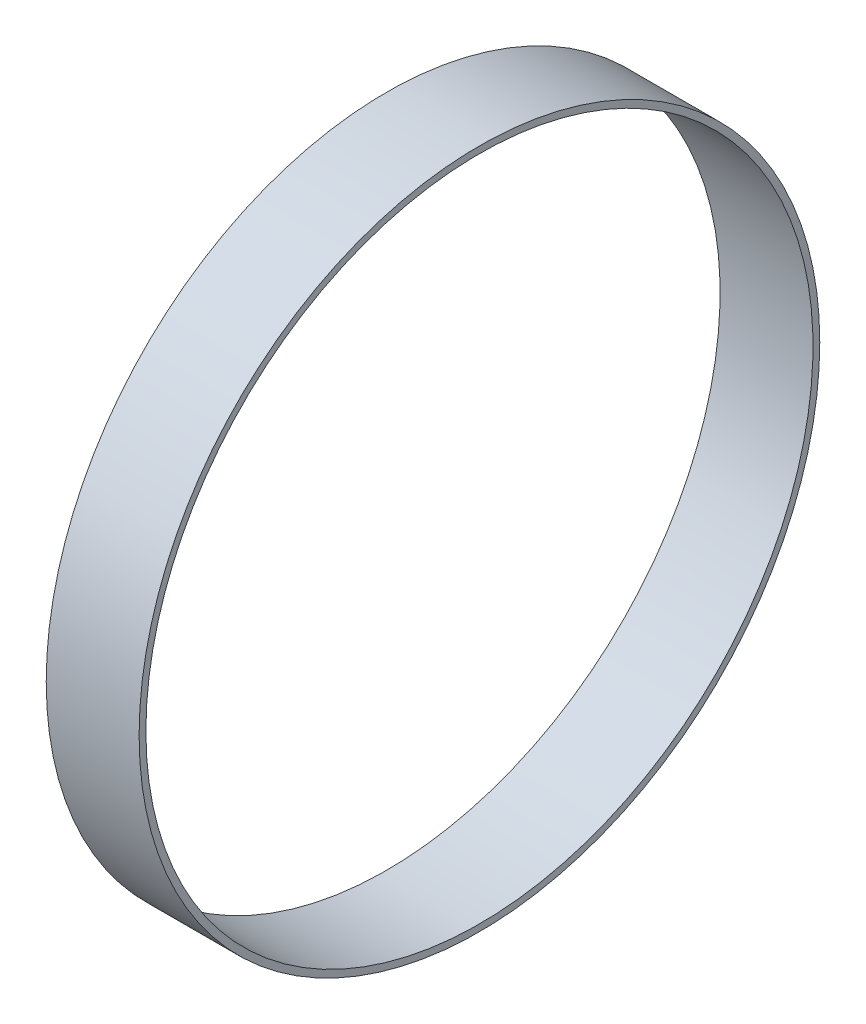
ISO-10303-21;
HEADER;
FILE_DESCRIPTION(('STEP AP214'),'2;1');
FILE_NAME('part.step','',(''),(''),'','','');
FILE_SCHEMA(('AUTOMOTIVE_DESIGN { 1 0 10303 214 1 1 1 1 }'));
ENDSEC;
DATA;
#1=APPLICATION_CONTEXT('core data for automotive mechanical design processes');
#2=APPLICATION_PROTOCOL_DEFINITION('international standard','automotive_design',2000,#1);
#3=PRODUCT_CONTEXT('',#1,'mechanical');
#4=PRODUCT('Part','Part','',(#3));
#5=PRODUCT_RELATED_PRODUCT_CATEGORY('part','',(#4));
#6=PRODUCT_DEFINITION_FORMATION('','',#4);
#7=PRODUCT_DEFINITION_CONTEXT('part definition',#1,'design');
#8=PRODUCT_DEFINITION('design','',#6,#7);
#9=PRODUCT_DEFINITION_SHAPE('','',#8);
#10=(LENGTH_UNIT() NAMED_UNIT(*) SI_UNIT(.MILLI.,.METRE.));
#11=(NAMED_UNIT(*) PLANE_ANGLE_UNIT() SI_UNIT($,.RADIAN.));
#12=(NAMED_UNIT(*) SI_UNIT($,.STERADIAN.) SOLID_ANGLE_UNIT());
#13=UNCERTAINTY_MEASURE_WITH_UNIT(LENGTH_MEASURE(1.E-05),#10,'distance_accuracy_value','');
#14=(GEOMETRIC_REPRESENTATION_CONTEXT(3) GLOBAL_UNCERTAINTY_ASSIGNED_CONTEXT((#13)) GLOBAL_UNIT_ASSIGNED_CONTEXT((#10,
#11,#12)) REPRESENTATION_CONTEXT('',''));
#15=CARTESIAN_POINT('',(0.,0.,0.));
#16=DIRECTION('',(0.,0.,1.));
#17=DIRECTION('',(1.,0.,0.));
#18=AXIS2_PLACEMENT_3D('',#15,#16,#17);
#19=CARTESIAN_POINT('',(0.,0.,0.));
#20=DIRECTION('',(-1.,0.,0.));
#21=DIRECTION('',(0.,0.,1.));
#22=AXIS2_PLACEMENT_3D('',#19,#20,#21);
#23=CYLINDRICAL_SURFACE('',#22,49.2);
#24=CARTESIAN_POINT('',(91.8,0.,0.));
#25=DIRECTION('',(-1.,0.,0.));
#26=DIRECTION('',(0.,0.,1.));
#27=AXIS2_PLACEMENT_3D('',#24,#25,#26);
#28=CIRCLE('',#27,49.2);
#29=CARTESIAN_POINT('',(91.8,0.,49.2));
#30=VERTEX_POINT('',#29);
#31=EDGE_CURVE('E43',#30,#30,#28,.T.);
#32=ORIENTED_EDGE('',*,*,#31,.F.);
#33=EDGE_LOOP('',(#32));
#34=FACE_BOUND('',#33,.T.);
#35=CARTESIAN_POINT('',(78.1,0.,0.));
#36=DIRECTION('',(-1.,0.,0.));
#37=DIRECTION('',(0.,0.,1.));
#38=AXIS2_PLACEMENT_3D('',#35,#36,#37);
#39=CIRCLE('',#38,49.2);
#40=CARTESIAN_POINT('',(78.1,0.,49.2));
#41=VERTEX_POINT('',#40);
#42=EDGE_CURVE('E10',#41,#41,#39,.T.);
#43=ORIENTED_EDGE('',*,*,#42,.T.);
#44=EDGE_LOOP('',(#43));
#45=FACE_BOUND('',#44,.T.);
#46=ADVANCED_FACE('F29',(#34,#45),#23,.F.);
#47=CARTESIAN_POINT('',(78.1,49.2,0.));
#48=DIRECTION('',(-1.,0.,0.));
#49=DIRECTION('',(0.,0.,1.));
#50=AXIS2_PLACEMENT_3D('',#47,#48,#49);
#51=PLANE('',#50);
#52=CARTESIAN_POINT('',(78.1,0.,0.));
#53=DIRECTION('',(-1.,0.,0.));
#54=DIRECTION('',(0.,0.,1.));
#55=AXIS2_PLACEMENT_3D('',#52,#53,#54);
#56=CIRCLE('',#55,50.2);
#57=CARTESIAN_POINT('',(78.1,0.,50.2));
#58=VERTEX_POINT('',#57);
#59=EDGE_CURVE('E35',#58,#58,#56,.T.);
#60=ORIENTED_EDGE('',*,*,#59,.T.);
#61=EDGE_LOOP('',(#60));
#62=FACE_BOUND('',#61,.T.);
#63=ORIENTED_EDGE('',*,*,#42,.F.);
#64=EDGE_LOOP('',(#63));
#65=FACE_BOUND('',#64,.T.);
#66=ADVANCED_FACE('F53',(#62,#65),#51,.T.);
#67=CARTESIAN_POINT('',(0.,0.,0.));
#68=DIRECTION('',(-1.,0.,0.));
#69=DIRECTION('',(0.,0.,1.));
#70=AXIS2_PLACEMENT_3D('',#67,#68,#69);
#71=CYLINDRICAL_SURFACE('',#70,50.2);
#72=CARTESIAN_POINT('',(91.8,0.,0.));
#73=DIRECTION('',(-1.,0.,0.));
#74=DIRECTION('',(0.,0.,1.));
#75=AXIS2_PLACEMENT_3D('',#72,#73,#74);
#76=CIRCLE('',#75,50.2);
#77=CARTESIAN_POINT('',(91.8,0.,50.2));
#78=VERTEX_POINT('',#77);
#79=EDGE_CURVE('E39',#78,#78,#76,.T.);
#80=ORIENTED_EDGE('',*,*,#79,.T.);
#81=EDGE_LOOP('',(#80));
#82=FACE_BOUND('',#81,.T.);
#83=ORIENTED_EDGE('',*,*,#59,.F.);
#84=EDGE_LOOP('',(#83));
#85=FACE_BOUND('',#84,.T.);
#86=ADVANCED_FACE('F57',(#82,#85),#71,.T.);
#87=CARTESIAN_POINT('',(91.8,50.2,0.));
#88=DIRECTION('',(1.,0.,0.));
#89=DIRECTION('',(0.,0.,-1.));
#90=AXIS2_PLACEMENT_3D('',#87,#88,#89);
#91=PLANE('',#90);
#92=ORIENTED_EDGE('',*,*,#31,.T.);
#93=EDGE_LOOP('',(#92));
#94=FACE_BOUND('',#93,.T.);
#95=ORIENTED_EDGE('',*,*,#79,.F.);
#96=EDGE_LOOP('',(#95));
#97=FACE_BOUND('',#96,.T.);
#98=ADVANCED_FACE('F49',(#94,#97),#91,.T.);
#99=CLOSED_SHELL('',(#46,#66,#86,#98));
#100=MANIFOLD_SOLID_BREP('B2',#99);
#101=ADVANCED_BREP_SHAPE_REPRESENTATION('',(#18,#100),#14);
#102=SHAPE_DEFINITION_REPRESENTATION(#9,#101);
ENDSEC;
END-ISO-10303-21;
